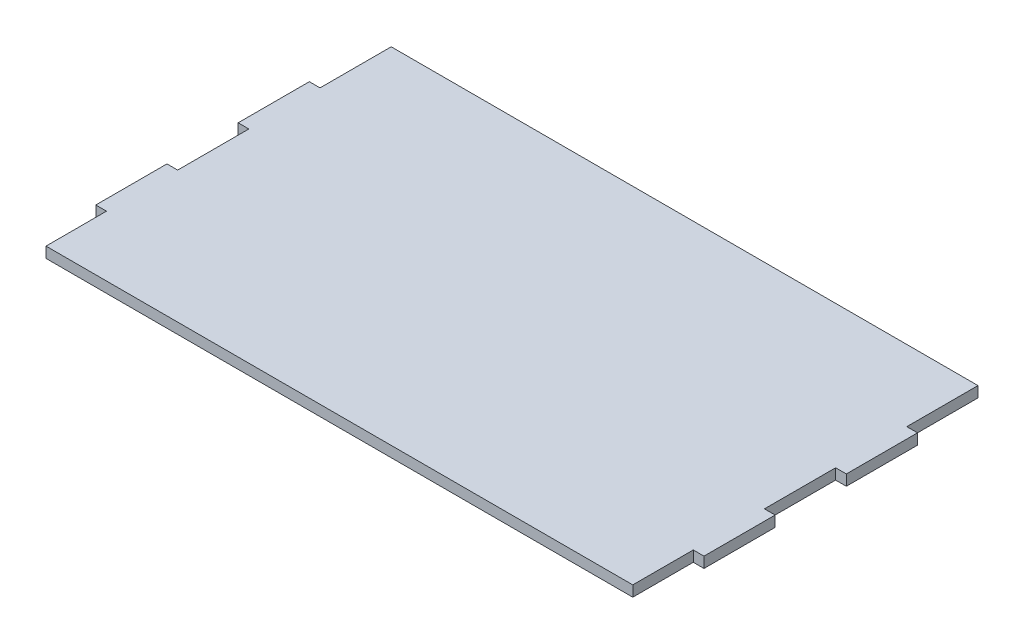
ISO-10303-21;
HEADER;
FILE_DESCRIPTION(('STEP AP214'),'2;1');
FILE_NAME('part.step','',(''),(''),'','','');
FILE_SCHEMA(('AUTOMOTIVE_DESIGN { 1 0 10303 214 1 1 1 1 }'));
ENDSEC;
DATA;
#1=APPLICATION_CONTEXT('core data for automotive mechanical design processes');
#2=APPLICATION_PROTOCOL_DEFINITION('international standard','automotive_design',2000,#1);
#3=PRODUCT_CONTEXT('',#1,'mechanical');
#4=PRODUCT('Part','Part','',(#3));
#5=PRODUCT_RELATED_PRODUCT_CATEGORY('part','',(#4));
#6=PRODUCT_DEFINITION_FORMATION('','',#4);
#7=PRODUCT_DEFINITION_CONTEXT('part definition',#1,'design');
#8=PRODUCT_DEFINITION('design','',#6,#7);
#9=PRODUCT_DEFINITION_SHAPE('','',#8);
#10=(LENGTH_UNIT() NAMED_UNIT(*) SI_UNIT(.MILLI.,.METRE.));
#11=(NAMED_UNIT(*) PLANE_ANGLE_UNIT() SI_UNIT($,.RADIAN.));
#12=(NAMED_UNIT(*) SI_UNIT($,.STERADIAN.) SOLID_ANGLE_UNIT());
#13=UNCERTAINTY_MEASURE_WITH_UNIT(LENGTH_MEASURE(1.E-05),#10,'distance_accuracy_value','');
#14=(GEOMETRIC_REPRESENTATION_CONTEXT(3) GLOBAL_UNCERTAINTY_ASSIGNED_CONTEXT((#13)) GLOBAL_UNIT_ASSIGNED_CONTEXT((#10,
#11,#12)) REPRESENTATION_CONTEXT('',''));
#15=CARTESIAN_POINT('',(0.,0.,0.));
#16=DIRECTION('',(0.,0.,1.));
#17=DIRECTION('',(1.,0.,0.));
#18=AXIS2_PLACEMENT_3D('',#15,#16,#17);
#19=CARTESIAN_POINT('',(-74.,2.7,42.185));
#20=DIRECTION('',(0.,0.,-1.));
#21=DIRECTION('',(-1.,0.,0.));
#22=AXIS2_PLACEMENT_3D('',#19,#20,#21);
#23=PLANE('',#22);
#24=DIRECTION('',(1.,0.,0.));
#25=VECTOR('',#24,1.);
#26=CARTESIAN_POINT('',(-74.,0.,42.185));
#27=LINE('',#26,#25);
#28=CARTESIAN_POINT('',(-74.,0.,42.185));
#29=VERTEX_POINT('',#28);
#30=CARTESIAN_POINT('',(74.,0.,42.185));
#31=VERTEX_POINT('',#30);
#32=EDGE_CURVE('E201',#29,#31,#27,.T.);
#33=ORIENTED_EDGE('',*,*,#32,.T.);
#34=DIRECTION('',(0.,-1.,0.));
#35=VECTOR('',#34,1.);
#36=CARTESIAN_POINT('',(74.,2.7,42.185));
#37=LINE('',#36,#35);
#38=CARTESIAN_POINT('',(74.,2.7,42.185));
#39=VERTEX_POINT('',#38);
#40=EDGE_CURVE('E11',#39,#31,#37,.T.);
#41=ORIENTED_EDGE('',*,*,#40,.F.);
#42=DIRECTION('',(1.,0.,0.));
#43=VECTOR('',#42,1.);
#44=CARTESIAN_POINT('',(-74.,2.7,42.185));
#45=LINE('',#44,#43);
#46=CARTESIAN_POINT('',(-74.,2.7,42.185));
#47=VERTEX_POINT('',#46);
#48=EDGE_CURVE('E239',#47,#39,#45,.T.);
#49=ORIENTED_EDGE('',*,*,#48,.F.);
#50=DIRECTION('',(0.,-1.,0.));
#51=VECTOR('',#50,1.);
#52=CARTESIAN_POINT('',(-74.,2.7,42.185));
#53=LINE('',#52,#51);
#54=EDGE_CURVE('E197',#47,#29,#53,.T.);
#55=ORIENTED_EDGE('',*,*,#54,.T.);
#56=EDGE_LOOP('',(#33,#41,#49,#55));
#57=FACE_BOUND('',#56,.T.);
#58=ADVANCED_FACE('F33',(#57),#23,.F.);
#59=CARTESIAN_POINT('',(74.,2.7,26.931));
#60=DIRECTION('',(-1.,0.,0.));
#61=DIRECTION('',(0.,0.,1.));
#62=AXIS2_PLACEMENT_3D('',#59,#60,#61);
#63=PLANE('',#62);
#64=DIRECTION('',(0.,0.,-1.));
#65=VECTOR('',#64,1.);
#66=CARTESIAN_POINT('',(74.,0.,26.931));
#67=LINE('',#66,#65);
#68=CARTESIAN_POINT('',(74.,0.,26.931));
#69=VERTEX_POINT('',#68);
#70=EDGE_CURVE('E204',#31,#69,#67,.T.);
#71=ORIENTED_EDGE('',*,*,#70,.T.);
#72=DIRECTION('',(0.,-1.,0.));
#73=VECTOR('',#72,1.);
#74=CARTESIAN_POINT('',(74.,2.7,26.931));
#75=LINE('',#74,#73);
#76=CARTESIAN_POINT('',(74.,2.7,26.931));
#77=VERTEX_POINT('',#76);
#78=EDGE_CURVE('E41',#77,#69,#75,.T.);
#79=ORIENTED_EDGE('',*,*,#78,.F.);
#80=DIRECTION('',(0.,0.,-1.));
#81=VECTOR('',#80,1.);
#82=CARTESIAN_POINT('',(74.,2.7,26.931));
#83=LINE('',#82,#81);
#84=EDGE_CURVE('E128',#39,#77,#83,.T.);
#85=ORIENTED_EDGE('',*,*,#84,.F.);
#86=ORIENTED_EDGE('',*,*,#40,.T.);
#87=EDGE_LOOP('',(#71,#79,#85,#86));
#88=FACE_BOUND('',#87,.T.);
#89=ADVANCED_FACE('F357',(#88),#63,.F.);
#90=CARTESIAN_POINT('',(76.7,2.7,26.931));
#91=DIRECTION('',(0.,0.,-1.));
#92=DIRECTION('',(-1.,0.,0.));
#93=AXIS2_PLACEMENT_3D('',#90,#91,#92);
#94=PLANE('',#93);
#95=DIRECTION('',(1.,0.,0.));
#96=VECTOR('',#95,1.);
#97=CARTESIAN_POINT('',(76.7,0.,26.931));
#98=LINE('',#97,#96);
#99=CARTESIAN_POINT('',(76.7,0.,26.931));
#100=VERTEX_POINT('',#99);
#101=EDGE_CURVE('E206',#69,#100,#98,.T.);
#102=ORIENTED_EDGE('',*,*,#101,.T.);
#103=DIRECTION('',(0.,-1.,0.));
#104=VECTOR('',#103,1.);
#105=CARTESIAN_POINT('',(76.7,2.7,26.931));
#106=LINE('',#105,#104);
#107=CARTESIAN_POINT('',(76.7,2.7,26.931));
#108=VERTEX_POINT('',#107);
#109=EDGE_CURVE('E282',#108,#100,#106,.T.);
#110=ORIENTED_EDGE('',*,*,#109,.F.);
#111=DIRECTION('',(1.,0.,0.));
#112=VECTOR('',#111,1.);
#113=CARTESIAN_POINT('',(76.7,2.7,26.931));
#114=LINE('',#113,#112);
#115=EDGE_CURVE('E290',#77,#108,#114,.T.);
#116=ORIENTED_EDGE('',*,*,#115,.F.);
#117=ORIENTED_EDGE('',*,*,#78,.T.);
#118=EDGE_LOOP('',(#102,#110,#116,#117));
#119=FACE_BOUND('',#118,.T.);
#120=ADVANCED_FACE('F288',(#119),#94,.F.);
#121=CARTESIAN_POINT('',(76.7,2.7,26.931));
#122=DIRECTION('',(-1.,0.,0.));
#123=DIRECTION('',(0.,0.,1.));
#124=AXIS2_PLACEMENT_3D('',#121,#122,#123);
#125=PLANE('',#124);
#126=DIRECTION('',(0.,0.,-1.));
#127=VECTOR('',#126,1.);
#128=CARTESIAN_POINT('',(76.7,0.,26.931));
#129=LINE('',#128,#127);
#130=CARTESIAN_POINT('',(76.7,0.,8.97699999999999));
#131=VERTEX_POINT('',#130);
#132=EDGE_CURVE('E208',#100,#131,#129,.T.);
#133=ORIENTED_EDGE('',*,*,#132,.T.);
#134=DIRECTION('',(0.,-1.,0.));
#135=VECTOR('',#134,1.);
#136=CARTESIAN_POINT('',(76.7,2.7,8.97699999999999));
#137=LINE('',#136,#135);
#138=CARTESIAN_POINT('',(76.7,2.7,8.97699999999999));
#139=VERTEX_POINT('',#138);
#140=EDGE_CURVE('E279',#139,#131,#137,.T.);
#141=ORIENTED_EDGE('',*,*,#140,.F.);
#142=DIRECTION('',(0.,0.,-1.));
#143=VECTOR('',#142,1.);
#144=CARTESIAN_POINT('',(76.7,2.7,26.931));
#145=LINE('',#144,#143);
#146=EDGE_CURVE('E308',#108,#139,#145,.T.);
#147=ORIENTED_EDGE('',*,*,#146,.F.);
#148=ORIENTED_EDGE('',*,*,#109,.T.);
#149=EDGE_LOOP('',(#133,#141,#147,#148));
#150=FACE_BOUND('',#149,.T.);
#151=ADVANCED_FACE('F299',(#150),#125,.F.);
#152=CARTESIAN_POINT('',(76.7,2.7,8.97699999999999));
#153=DIRECTION('',(0.,0.,1.));
#154=DIRECTION('',(1.,0.,0.));
#155=AXIS2_PLACEMENT_3D('',#152,#153,#154);
#156=PLANE('',#155);
#157=DIRECTION('',(-1.,0.,0.));
#158=VECTOR('',#157,1.);
#159=CARTESIAN_POINT('',(76.7,0.,8.97699999999999));
#160=LINE('',#159,#158);
#161=CARTESIAN_POINT('',(74.,0.,8.97699999999998));
#162=VERTEX_POINT('',#161);
#163=EDGE_CURVE('E210',#131,#162,#160,.T.);
#164=ORIENTED_EDGE('',*,*,#163,.T.);
#165=DIRECTION('',(0.,-1.,0.));
#166=VECTOR('',#165,1.);
#167=CARTESIAN_POINT('',(74.,2.7,8.97699999999998));
#168=LINE('',#167,#166);
#169=CARTESIAN_POINT('',(74.,2.7,8.97699999999998));
#170=VERTEX_POINT('',#169);
#171=EDGE_CURVE('E276',#170,#162,#168,.T.);
#172=ORIENTED_EDGE('',*,*,#171,.F.);
#173=DIRECTION('',(-1.,0.,0.));
#174=VECTOR('',#173,1.);
#175=CARTESIAN_POINT('',(76.7,2.7,8.97699999999999));
#176=LINE('',#175,#174);
#177=EDGE_CURVE('E305',#139,#170,#176,.T.);
#178=ORIENTED_EDGE('',*,*,#177,.F.);
#179=ORIENTED_EDGE('',*,*,#140,.T.);
#180=EDGE_LOOP('',(#164,#172,#178,#179));
#181=FACE_BOUND('',#180,.T.);
#182=ADVANCED_FACE('F303',(#181),#156,.F.);
#183=CARTESIAN_POINT('',(74.,2.7,-8.97700000000001));
#184=DIRECTION('',(-1.,0.,0.));
#185=DIRECTION('',(0.,0.,1.));
#186=AXIS2_PLACEMENT_3D('',#183,#184,#185);
#187=PLANE('',#186);
#188=DIRECTION('',(0.,0.,-1.));
#189=VECTOR('',#188,1.);
#190=CARTESIAN_POINT('',(74.,0.,-8.97700000000001));
#191=LINE('',#190,#189);
#192=CARTESIAN_POINT('',(74.,0.,-8.97700000000001));
#193=VERTEX_POINT('',#192);
#194=EDGE_CURVE('E212',#162,#193,#191,.T.);
#195=ORIENTED_EDGE('',*,*,#194,.T.);
#196=DIRECTION('',(0.,-1.,0.));
#197=VECTOR('',#196,1.);
#198=CARTESIAN_POINT('',(74.,2.7,-8.97700000000001));
#199=LINE('',#198,#197);
#200=CARTESIAN_POINT('',(74.,2.7,-8.97700000000001));
#201=VERTEX_POINT('',#200);
#202=EDGE_CURVE('E273',#201,#193,#199,.T.);
#203=ORIENTED_EDGE('',*,*,#202,.F.);
#204=DIRECTION('',(0.,0.,-1.));
#205=VECTOR('',#204,1.);
#206=CARTESIAN_POINT('',(74.,2.7,-8.97700000000001));
#207=LINE('',#206,#205);
#208=EDGE_CURVE('E307',#170,#201,#207,.T.);
#209=ORIENTED_EDGE('',*,*,#208,.F.);
#210=ORIENTED_EDGE('',*,*,#171,.T.);
#211=EDGE_LOOP('',(#195,#203,#209,#210));
#212=FACE_BOUND('',#211,.T.);
#213=ADVANCED_FACE('F370',(#212),#187,.F.);
#214=CARTESIAN_POINT('',(76.7,2.7,-8.97700000000001));
#215=DIRECTION('',(0.,0.,-1.));
#216=DIRECTION('',(-1.,0.,0.));
#217=AXIS2_PLACEMENT_3D('',#214,#215,#216);
#218=PLANE('',#217);
#219=DIRECTION('',(1.,0.,0.));
#220=VECTOR('',#219,1.);
#221=CARTESIAN_POINT('',(76.7,0.,-8.97700000000001));
#222=LINE('',#221,#220);
#223=CARTESIAN_POINT('',(76.7,0.,-8.97700000000001));
#224=VERTEX_POINT('',#223);
#225=EDGE_CURVE('E214',#193,#224,#222,.T.);
#226=ORIENTED_EDGE('',*,*,#225,.T.);
#227=DIRECTION('',(0.,-1.,0.));
#228=VECTOR('',#227,1.);
#229=CARTESIAN_POINT('',(76.7,2.7,-8.97700000000001));
#230=LINE('',#229,#228);
#231=CARTESIAN_POINT('',(76.7,2.7,-8.97700000000001));
#232=VERTEX_POINT('',#231);
#233=EDGE_CURVE('E270',#232,#224,#230,.T.);
#234=ORIENTED_EDGE('',*,*,#233,.F.);
#235=DIRECTION('',(1.,0.,0.));
#236=VECTOR('',#235,1.);
#237=CARTESIAN_POINT('',(76.7,2.7,-8.97700000000001));
#238=LINE('',#237,#236);
#239=EDGE_CURVE('E310',#201,#232,#238,.T.);
#240=ORIENTED_EDGE('',*,*,#239,.F.);
#241=ORIENTED_EDGE('',*,*,#202,.T.);
#242=EDGE_LOOP('',(#226,#234,#240,#241));
#243=FACE_BOUND('',#242,.T.);
#244=ADVANCED_FACE('F373',(#243),#218,.F.);
#245=CARTESIAN_POINT('',(76.7,2.7,-8.97700000000001));
#246=DIRECTION('',(-1.,0.,0.));
#247=DIRECTION('',(0.,0.,1.));
#248=AXIS2_PLACEMENT_3D('',#245,#246,#247);
#249=PLANE('',#248);
#250=DIRECTION('',(0.,0.,-1.));
#251=VECTOR('',#250,1.);
#252=CARTESIAN_POINT('',(76.7,0.,-8.97700000000001));
#253=LINE('',#252,#251);
#254=CARTESIAN_POINT('',(76.7,0.,-26.931));
#255=VERTEX_POINT('',#254);
#256=EDGE_CURVE('E216',#224,#255,#253,.T.);
#257=ORIENTED_EDGE('',*,*,#256,.T.);
#258=DIRECTION('',(0.,-1.,0.));
#259=VECTOR('',#258,1.);
#260=CARTESIAN_POINT('',(76.7,2.7,-26.931));
#261=LINE('',#260,#259);
#262=CARTESIAN_POINT('',(76.7,2.7,-26.931));
#263=VERTEX_POINT('',#262);
#264=EDGE_CURVE('E267',#263,#255,#261,.T.);
#265=ORIENTED_EDGE('',*,*,#264,.F.);
#266=DIRECTION('',(0.,0.,-1.));
#267=VECTOR('',#266,1.);
#268=CARTESIAN_POINT('',(76.7,2.7,-8.97700000000001));
#269=LINE('',#268,#267);
#270=EDGE_CURVE('E316',#232,#263,#269,.T.);
#271=ORIENTED_EDGE('',*,*,#270,.F.);
#272=ORIENTED_EDGE('',*,*,#233,.T.);
#273=EDGE_LOOP('',(#257,#265,#271,#272));
#274=FACE_BOUND('',#273,.T.);
#275=ADVANCED_FACE('F377',(#274),#249,.F.);
#276=CARTESIAN_POINT('',(76.7,2.7,-26.931));
#277=DIRECTION('',(0.,0.,1.));
#278=DIRECTION('',(1.,0.,0.));
#279=AXIS2_PLACEMENT_3D('',#276,#277,#278);
#280=PLANE('',#279);
#281=DIRECTION('',(-1.,0.,0.));
#282=VECTOR('',#281,1.);
#283=CARTESIAN_POINT('',(76.7,0.,-26.931));
#284=LINE('',#283,#282);
#285=CARTESIAN_POINT('',(74.,0.,-26.931));
#286=VERTEX_POINT('',#285);
#287=EDGE_CURVE('E218',#255,#286,#284,.T.);
#288=ORIENTED_EDGE('',*,*,#287,.T.);
#289=DIRECTION('',(0.,-1.,0.));
#290=VECTOR('',#289,1.);
#291=CARTESIAN_POINT('',(74.,2.7,-26.931));
#292=LINE('',#291,#290);
#293=CARTESIAN_POINT('',(74.,2.7,-26.931));
#294=VERTEX_POINT('',#293);
#295=EDGE_CURVE('E264',#294,#286,#292,.T.);
#296=ORIENTED_EDGE('',*,*,#295,.F.);
#297=DIRECTION('',(-1.,0.,0.));
#298=VECTOR('',#297,1.);
#299=CARTESIAN_POINT('',(76.7,2.7,-26.931));
#300=LINE('',#299,#298);
#301=EDGE_CURVE('E318',#263,#294,#300,.T.);
#302=ORIENTED_EDGE('',*,*,#301,.F.);
#303=ORIENTED_EDGE('',*,*,#264,.T.);
#304=EDGE_LOOP('',(#288,#296,#302,#303));
#305=FACE_BOUND('',#304,.T.);
#306=ADVANCED_FACE('F381',(#305),#280,.F.);
#307=CARTESIAN_POINT('',(74.,2.7,-44.885));
#308=DIRECTION('',(-1.,0.,0.));
#309=DIRECTION('',(0.,0.,1.));
#310=AXIS2_PLACEMENT_3D('',#307,#308,#309);
#311=PLANE('',#310);
#312=DIRECTION('',(0.,0.,-1.));
#313=VECTOR('',#312,1.);
#314=CARTESIAN_POINT('',(74.,0.,-44.885));
#315=LINE('',#314,#313);
#316=CARTESIAN_POINT('',(74.,0.,-44.885));
#317=VERTEX_POINT('',#316);
#318=EDGE_CURVE('E220',#286,#317,#315,.T.);
#319=ORIENTED_EDGE('',*,*,#318,.T.);
#320=DIRECTION('',(0.,-1.,0.));
#321=VECTOR('',#320,1.);
#322=CARTESIAN_POINT('',(74.,2.7,-44.885));
#323=LINE('',#322,#321);
#324=CARTESIAN_POINT('',(74.,2.7,-44.885));
#325=VERTEX_POINT('',#324);
#326=EDGE_CURVE('E261',#325,#317,#323,.T.);
#327=ORIENTED_EDGE('',*,*,#326,.F.);
#328=DIRECTION('',(0.,0.,-1.));
#329=VECTOR('',#328,1.);
#330=CARTESIAN_POINT('',(74.,2.7,-44.885));
#331=LINE('',#330,#329);
#332=EDGE_CURVE('E320',#294,#325,#331,.T.);
#333=ORIENTED_EDGE('',*,*,#332,.F.);
#334=ORIENTED_EDGE('',*,*,#295,.T.);
#335=EDGE_LOOP('',(#319,#327,#333,#334));
#336=FACE_BOUND('',#335,.T.);
#337=ADVANCED_FACE('F385',(#336),#311,.F.);
#338=CARTESIAN_POINT('',(74.,2.7,-44.885));
#339=DIRECTION('',(0.,0.,1.));
#340=DIRECTION('',(1.,0.,0.));
#341=AXIS2_PLACEMENT_3D('',#338,#339,#340);
#342=PLANE('',#341);
#343=DIRECTION('',(-1.,0.,0.));
#344=VECTOR('',#343,1.);
#345=CARTESIAN_POINT('',(74.,0.,-44.885));
#346=LINE('',#345,#344);
#347=CARTESIAN_POINT('',(-74.,0.,-44.885));
#348=VERTEX_POINT('',#347);
#349=EDGE_CURVE('E222',#317,#348,#346,.T.);
#350=ORIENTED_EDGE('',*,*,#349,.T.);
#351=DIRECTION('',(0.,-1.,0.));
#352=VECTOR('',#351,1.);
#353=CARTESIAN_POINT('',(-74.,2.7,-44.885));
#354=LINE('',#353,#352);
#355=CARTESIAN_POINT('',(-74.,2.7,-44.885));
#356=VERTEX_POINT('',#355);
#357=EDGE_CURVE('E258',#356,#348,#354,.T.);
#358=ORIENTED_EDGE('',*,*,#357,.F.);
#359=DIRECTION('',(-1.,0.,0.));
#360=VECTOR('',#359,1.);
#361=CARTESIAN_POINT('',(74.,2.7,-44.885));
#362=LINE('',#361,#360);
#363=EDGE_CURVE('E322',#325,#356,#362,.T.);
#364=ORIENTED_EDGE('',*,*,#363,.F.);
#365=ORIENTED_EDGE('',*,*,#326,.T.);
#366=EDGE_LOOP('',(#350,#358,#364,#365));
#367=FACE_BOUND('',#366,.T.);
#368=ADVANCED_FACE('F389',(#367),#342,.F.);
#369=CARTESIAN_POINT('',(-74.,2.7,-26.931));
#370=DIRECTION('',(1.,0.,0.));
#371=DIRECTION('',(0.,0.,-1.));
#372=AXIS2_PLACEMENT_3D('',#369,#370,#371);
#373=PLANE('',#372);
#374=DIRECTION('',(0.,0.,1.));
#375=VECTOR('',#374,1.);
#376=CARTESIAN_POINT('',(-74.,0.,-26.931));
#377=LINE('',#376,#375);
#378=CARTESIAN_POINT('',(-74.,0.,-26.931));
#379=VERTEX_POINT('',#378);
#380=EDGE_CURVE('E224',#348,#379,#377,.T.);
#381=ORIENTED_EDGE('',*,*,#380,.T.);
#382=DIRECTION('',(0.,-1.,0.));
#383=VECTOR('',#382,1.);
#384=CARTESIAN_POINT('',(-74.,2.7,-26.931));
#385=LINE('',#384,#383);
#386=CARTESIAN_POINT('',(-74.,2.7,-26.931));
#387=VERTEX_POINT('',#386);
#388=EDGE_CURVE('E255',#387,#379,#385,.T.);
#389=ORIENTED_EDGE('',*,*,#388,.F.);
#390=DIRECTION('',(0.,0.,1.));
#391=VECTOR('',#390,1.);
#392=CARTESIAN_POINT('',(-74.,2.7,-26.931));
#393=LINE('',#392,#391);
#394=EDGE_CURVE('E324',#356,#387,#393,.T.);
#395=ORIENTED_EDGE('',*,*,#394,.F.);
#396=ORIENTED_EDGE('',*,*,#357,.T.);
#397=EDGE_LOOP('',(#381,#389,#395,#396));
#398=FACE_BOUND('',#397,.T.);
#399=ADVANCED_FACE('F393',(#398),#373,.F.);
#400=CARTESIAN_POINT('',(-76.7,2.7,-26.931));
#401=DIRECTION('',(0.,0.,1.));
#402=DIRECTION('',(1.,0.,0.));
#403=AXIS2_PLACEMENT_3D('',#400,#401,#402);
#404=PLANE('',#403);
#405=DIRECTION('',(-1.,0.,0.));
#406=VECTOR('',#405,1.);
#407=CARTESIAN_POINT('',(-76.7,0.,-26.931));
#408=LINE('',#407,#406);
#409=CARTESIAN_POINT('',(-76.7,0.,-26.931));
#410=VERTEX_POINT('',#409);
#411=EDGE_CURVE('E226',#379,#410,#408,.T.);
#412=ORIENTED_EDGE('',*,*,#411,.T.);
#413=DIRECTION('',(0.,-1.,0.));
#414=VECTOR('',#413,1.);
#415=CARTESIAN_POINT('',(-76.7,2.7,-26.931));
#416=LINE('',#415,#414);
#417=CARTESIAN_POINT('',(-76.7,2.7,-26.931));
#418=VERTEX_POINT('',#417);
#419=EDGE_CURVE('E252',#418,#410,#416,.T.);
#420=ORIENTED_EDGE('',*,*,#419,.F.);
#421=DIRECTION('',(-1.,0.,0.));
#422=VECTOR('',#421,1.);
#423=CARTESIAN_POINT('',(-76.7,2.7,-26.931));
#424=LINE('',#423,#422);
#425=EDGE_CURVE('E326',#387,#418,#424,.T.);
#426=ORIENTED_EDGE('',*,*,#425,.F.);
#427=ORIENTED_EDGE('',*,*,#388,.T.);
#428=EDGE_LOOP('',(#412,#420,#426,#427));
#429=FACE_BOUND('',#428,.T.);
#430=ADVANCED_FACE('F397',(#429),#404,.F.);
#431=CARTESIAN_POINT('',(-76.7,2.7,-8.97699999999998));
#432=DIRECTION('',(1.,0.,0.));
#433=DIRECTION('',(0.,0.,-1.));
#434=AXIS2_PLACEMENT_3D('',#431,#432,#433);
#435=PLANE('',#434);
#436=DIRECTION('',(0.,0.,1.));
#437=VECTOR('',#436,1.);
#438=CARTESIAN_POINT('',(-76.7,0.,-8.97699999999998));
#439=LINE('',#438,#437);
#440=CARTESIAN_POINT('',(-76.7,0.,-8.97699999999998));
#441=VERTEX_POINT('',#440);
#442=EDGE_CURVE('E228',#410,#441,#439,.T.);
#443=ORIENTED_EDGE('',*,*,#442,.T.);
#444=DIRECTION('',(0.,-1.,0.));
#445=VECTOR('',#444,1.);
#446=CARTESIAN_POINT('',(-76.7,2.7,-8.97699999999998));
#447=LINE('',#446,#445);
#448=CARTESIAN_POINT('',(-76.7,2.7,-8.97699999999998));
#449=VERTEX_POINT('',#448);
#450=EDGE_CURVE('E249',#449,#441,#447,.T.);
#451=ORIENTED_EDGE('',*,*,#450,.F.);
#452=DIRECTION('',(0.,0.,1.));
#453=VECTOR('',#452,1.);
#454=CARTESIAN_POINT('',(-76.7,2.7,-8.97699999999998));
#455=LINE('',#454,#453);
#456=EDGE_CURVE('E328',#418,#449,#455,.T.);
#457=ORIENTED_EDGE('',*,*,#456,.F.);
#458=ORIENTED_EDGE('',*,*,#419,.T.);
#459=EDGE_LOOP('',(#443,#451,#457,#458));
#460=FACE_BOUND('',#459,.T.);
#461=ADVANCED_FACE('F401',(#460),#435,.F.);
#462=CARTESIAN_POINT('',(-76.7,2.7,-8.97699999999998));
#463=DIRECTION('',(0.,0.,-1.));
#464=DIRECTION('',(-1.,0.,0.));
#465=AXIS2_PLACEMENT_3D('',#462,#463,#464);
#466=PLANE('',#465);
#467=DIRECTION('',(1.,0.,0.));
#468=VECTOR('',#467,1.);
#469=CARTESIAN_POINT('',(-76.7,0.,-8.97699999999998));
#470=LINE('',#469,#468);
#471=CARTESIAN_POINT('',(-74.,0.,-8.97699999999998));
#472=VERTEX_POINT('',#471);
#473=EDGE_CURVE('E230',#441,#472,#470,.T.);
#474=ORIENTED_EDGE('',*,*,#473,.T.);
#475=DIRECTION('',(0.,-1.,0.));
#476=VECTOR('',#475,1.);
#477=CARTESIAN_POINT('',(-74.,2.7,-8.97699999999998));
#478=LINE('',#477,#476);
#479=CARTESIAN_POINT('',(-74.,2.7,-8.97699999999998));
#480=VERTEX_POINT('',#479);
#481=EDGE_CURVE('E246',#480,#472,#478,.T.);
#482=ORIENTED_EDGE('',*,*,#481,.F.);
#483=DIRECTION('',(1.,0.,0.));
#484=VECTOR('',#483,1.);
#485=CARTESIAN_POINT('',(-76.7,2.7,-8.97699999999998));
#486=LINE('',#485,#484);
#487=EDGE_CURVE('E330',#449,#480,#486,.T.);
#488=ORIENTED_EDGE('',*,*,#487,.F.);
#489=ORIENTED_EDGE('',*,*,#450,.T.);
#490=EDGE_LOOP('',(#474,#482,#488,#489));
#491=FACE_BOUND('',#490,.T.);
#492=ADVANCED_FACE('F405',(#491),#466,.F.);
#493=CARTESIAN_POINT('',(-74.,2.7,-8.97699999999998));
#494=DIRECTION('',(1.,0.,0.));
#495=DIRECTION('',(0.,0.,-1.));
#496=AXIS2_PLACEMENT_3D('',#493,#494,#495);
#497=PLANE('',#496);
#498=DIRECTION('',(0.,0.,1.));
#499=VECTOR('',#498,1.);
#500=CARTESIAN_POINT('',(-74.,0.,-8.97699999999998));
#501=LINE('',#500,#499);
#502=CARTESIAN_POINT('',(-74.,0.,8.97699999999999));
#503=VERTEX_POINT('',#502);
#504=EDGE_CURVE('E232',#472,#503,#501,.T.);
#505=ORIENTED_EDGE('',*,*,#504,.T.);
#506=DIRECTION('',(0.,-1.,0.));
#507=VECTOR('',#506,1.);
#508=CARTESIAN_POINT('',(-74.,2.7,8.97699999999999));
#509=LINE('',#508,#507);
#510=CARTESIAN_POINT('',(-74.,2.7,8.97699999999999));
#511=VERTEX_POINT('',#510);
#512=EDGE_CURVE('E243',#511,#503,#509,.T.);
#513=ORIENTED_EDGE('',*,*,#512,.F.);
#514=DIRECTION('',(0.,0.,1.));
#515=VECTOR('',#514,1.);
#516=CARTESIAN_POINT('',(-74.,2.7,-8.97699999999998));
#517=LINE('',#516,#515);
#518=EDGE_CURVE('E332',#480,#511,#517,.T.);
#519=ORIENTED_EDGE('',*,*,#518,.F.);
#520=ORIENTED_EDGE('',*,*,#481,.T.);
#521=EDGE_LOOP('',(#505,#513,#519,#520));
#522=FACE_BOUND('',#521,.T.);
#523=ADVANCED_FACE('F338',(#522),#497,.F.);
#524=CARTESIAN_POINT('',(-76.7,2.7,8.97700000000002));
#525=DIRECTION('',(0.,0.,1.));
#526=DIRECTION('',(1.,0.,0.));
#527=AXIS2_PLACEMENT_3D('',#524,#525,#526);
#528=PLANE('',#527);
#529=DIRECTION('',(-1.,0.,0.));
#530=VECTOR('',#529,1.);
#531=CARTESIAN_POINT('',(-76.7,0.,8.97700000000002));
#532=LINE('',#531,#530);
#533=CARTESIAN_POINT('',(-76.7,0.,8.97700000000002));
#534=VERTEX_POINT('',#533);
#535=EDGE_CURVE('E234',#503,#534,#532,.T.);
#536=ORIENTED_EDGE('',*,*,#535,.T.);
#537=DIRECTION('',(0.,-1.,0.));
#538=VECTOR('',#537,1.);
#539=CARTESIAN_POINT('',(-76.7,2.7,8.97700000000002));
#540=LINE('',#539,#538);
#541=CARTESIAN_POINT('',(-76.7,2.7,8.97700000000002));
#542=VERTEX_POINT('',#541);
#543=EDGE_CURVE('E192',#542,#534,#540,.T.);
#544=ORIENTED_EDGE('',*,*,#543,.F.);
#545=DIRECTION('',(-1.,0.,0.));
#546=VECTOR('',#545,1.);
#547=CARTESIAN_POINT('',(-76.7,2.7,8.97700000000002));
#548=LINE('',#547,#546);
#549=EDGE_CURVE('E183',#511,#542,#548,.T.);
#550=ORIENTED_EDGE('',*,*,#549,.F.);
#551=ORIENTED_EDGE('',*,*,#512,.T.);
#552=EDGE_LOOP('',(#536,#544,#550,#551));
#553=FACE_BOUND('',#552,.T.);
#554=ADVANCED_FACE('F342',(#553),#528,.F.);
#555=CARTESIAN_POINT('',(-76.7,2.7,26.931));
#556=DIRECTION('',(1.,0.,0.));
#557=DIRECTION('',(0.,0.,-1.));
#558=AXIS2_PLACEMENT_3D('',#555,#556,#557);
#559=PLANE('',#558);
#560=DIRECTION('',(0.,0.,1.));
#561=VECTOR('',#560,1.);
#562=CARTESIAN_POINT('',(-76.7,0.,26.931));
#563=LINE('',#562,#561);
#564=CARTESIAN_POINT('',(-76.7,0.,26.931));
#565=VERTEX_POINT('',#564);
#566=EDGE_CURVE('E191',#534,#565,#563,.T.);
#567=ORIENTED_EDGE('',*,*,#566,.T.);
#568=DIRECTION('',(0.,-1.,0.));
#569=VECTOR('',#568,1.);
#570=CARTESIAN_POINT('',(-76.7,2.7,26.931));
#571=LINE('',#570,#569);
#572=CARTESIAN_POINT('',(-76.7,2.7,26.931));
#573=VERTEX_POINT('',#572);
#574=EDGE_CURVE('E188',#573,#565,#571,.T.);
#575=ORIENTED_EDGE('',*,*,#574,.F.);
#576=DIRECTION('',(0.,0.,1.));
#577=VECTOR('',#576,1.);
#578=CARTESIAN_POINT('',(-76.7,2.7,26.931));
#579=LINE('',#578,#577);
#580=EDGE_CURVE('E177',#542,#573,#579,.T.);
#581=ORIENTED_EDGE('',*,*,#580,.F.);
#582=ORIENTED_EDGE('',*,*,#543,.T.);
#583=EDGE_LOOP('',(#567,#575,#581,#582));
#584=FACE_BOUND('',#583,.T.);
#585=ADVANCED_FACE('F189',(#584),#559,.F.);
#586=CARTESIAN_POINT('',(-76.7,2.7,26.931));
#587=DIRECTION('',(0.,0.,-1.));
#588=DIRECTION('',(-1.,0.,0.));
#589=AXIS2_PLACEMENT_3D('',#586,#587,#588);
#590=PLANE('',#589);
#591=DIRECTION('',(1.,0.,0.));
#592=VECTOR('',#591,1.);
#593=CARTESIAN_POINT('',(-76.7,0.,26.931));
#594=LINE('',#593,#592);
#595=CARTESIAN_POINT('',(-74.,0.,26.931));
#596=VERTEX_POINT('',#595);
#597=EDGE_CURVE('E114',#565,#596,#594,.T.);
#598=ORIENTED_EDGE('',*,*,#597,.T.);
#599=DIRECTION('',(0.,-1.,0.));
#600=VECTOR('',#599,1.);
#601=CARTESIAN_POINT('',(-74.,2.7,26.931));
#602=LINE('',#601,#600);
#603=CARTESIAN_POINT('',(-74.,2.7,26.931));
#604=VERTEX_POINT('',#603);
#605=EDGE_CURVE('E193',#604,#596,#602,.T.);
#606=ORIENTED_EDGE('',*,*,#605,.F.);
#607=DIRECTION('',(1.,0.,0.));
#608=VECTOR('',#607,1.);
#609=CARTESIAN_POINT('',(-76.7,2.7,26.931));
#610=LINE('',#609,#608);
#611=EDGE_CURVE('E181',#573,#604,#610,.T.);
#612=ORIENTED_EDGE('',*,*,#611,.F.);
#613=ORIENTED_EDGE('',*,*,#574,.T.);
#614=EDGE_LOOP('',(#598,#606,#612,#613));
#615=FACE_BOUND('',#614,.T.);
#616=ADVANCED_FACE('F195',(#615),#590,.F.);
#617=CARTESIAN_POINT('',(-74.,2.7,26.931));
#618=DIRECTION('',(1.,0.,0.));
#619=DIRECTION('',(0.,0.,-1.));
#620=AXIS2_PLACEMENT_3D('',#617,#618,#619);
#621=PLANE('',#620);
#622=DIRECTION('',(0.,0.,1.));
#623=VECTOR('',#622,1.);
#624=CARTESIAN_POINT('',(-74.,0.,26.931));
#625=LINE('',#624,#623);
#626=EDGE_CURVE('E120',#596,#29,#625,.T.);
#627=ORIENTED_EDGE('',*,*,#626,.T.);
#628=ORIENTED_EDGE('',*,*,#54,.F.);
#629=DIRECTION('',(0.,0.,1.));
#630=VECTOR('',#629,1.);
#631=CARTESIAN_POINT('',(-74.,2.7,26.931));
#632=LINE('',#631,#630);
#633=EDGE_CURVE('E49',#604,#47,#632,.T.);
#634=ORIENTED_EDGE('',*,*,#633,.F.);
#635=ORIENTED_EDGE('',*,*,#605,.T.);
#636=EDGE_LOOP('',(#627,#628,#634,#635));
#637=FACE_BOUND('',#636,.T.);
#638=ADVANCED_FACE('F346',(#637),#621,.F.);
#639=CARTESIAN_POINT('',(0.,2.7,0.));
#640=DIRECTION('',(0.,-1.,0.));
#641=DIRECTION('',(0.,0.,-1.));
#642=AXIS2_PLACEMENT_3D('',#639,#640,#641);
#643=PLANE('',#642);
#644=ORIENTED_EDGE('',*,*,#48,.T.);
#645=ORIENTED_EDGE('',*,*,#84,.T.);
#646=ORIENTED_EDGE('',*,*,#115,.T.);
#647=ORIENTED_EDGE('',*,*,#146,.T.);
#648=ORIENTED_EDGE('',*,*,#177,.T.);
#649=ORIENTED_EDGE('',*,*,#208,.T.);
#650=ORIENTED_EDGE('',*,*,#239,.T.);
#651=ORIENTED_EDGE('',*,*,#270,.T.);
#652=ORIENTED_EDGE('',*,*,#301,.T.);
#653=ORIENTED_EDGE('',*,*,#332,.T.);
#654=ORIENTED_EDGE('',*,*,#363,.T.);
#655=ORIENTED_EDGE('',*,*,#394,.T.);
#656=ORIENTED_EDGE('',*,*,#425,.T.);
#657=ORIENTED_EDGE('',*,*,#456,.T.);
#658=ORIENTED_EDGE('',*,*,#487,.T.);
#659=ORIENTED_EDGE('',*,*,#518,.T.);
#660=ORIENTED_EDGE('',*,*,#549,.T.);
#661=ORIENTED_EDGE('',*,*,#580,.T.);
#662=ORIENTED_EDGE('',*,*,#611,.T.);
#663=ORIENTED_EDGE('',*,*,#633,.T.);
#664=EDGE_LOOP('',(#644,#645,#646,#647,#648,#649,#650,#651,#652,#653,#654,#655,#656,#657,#658,
#659,#660,#661,#662,#663));
#665=FACE_BOUND('',#664,.T.);
#666=ADVANCED_FACE('F179',(#665),#643,.F.);
#667=CARTESIAN_POINT('',(0.,0.,0.));
#668=DIRECTION('',(0.,-1.,0.));
#669=DIRECTION('',(0.,0.,-1.));
#670=AXIS2_PLACEMENT_3D('',#667,#668,#669);
#671=PLANE('',#670);
#672=ORIENTED_EDGE('',*,*,#32,.F.);
#673=ORIENTED_EDGE('',*,*,#626,.F.);
#674=ORIENTED_EDGE('',*,*,#597,.F.);
#675=ORIENTED_EDGE('',*,*,#566,.F.);
#676=ORIENTED_EDGE('',*,*,#535,.F.);
#677=ORIENTED_EDGE('',*,*,#504,.F.);
#678=ORIENTED_EDGE('',*,*,#473,.F.);
#679=ORIENTED_EDGE('',*,*,#442,.F.);
#680=ORIENTED_EDGE('',*,*,#411,.F.);
#681=ORIENTED_EDGE('',*,*,#380,.F.);
#682=ORIENTED_EDGE('',*,*,#349,.F.);
#683=ORIENTED_EDGE('',*,*,#318,.F.);
#684=ORIENTED_EDGE('',*,*,#287,.F.);
#685=ORIENTED_EDGE('',*,*,#256,.F.);
#686=ORIENTED_EDGE('',*,*,#225,.F.);
#687=ORIENTED_EDGE('',*,*,#194,.F.);
#688=ORIENTED_EDGE('',*,*,#163,.F.);
#689=ORIENTED_EDGE('',*,*,#132,.F.);
#690=ORIENTED_EDGE('',*,*,#101,.F.);
#691=ORIENTED_EDGE('',*,*,#70,.F.);
#692=EDGE_LOOP('',(#672,#673,#674,#675,#676,#677,#678,#679,#680,#681,#682,#683,#684,#685,#686,
#687,#688,#689,#690,#691));
#693=FACE_BOUND('',#692,.T.);
#694=ADVANCED_FACE('F294',(#693),#671,.T.);
#695=CLOSED_SHELL('',(#58,#89,#120,#151,#182,#213,#244,#275,#306,#337,#368,#399,#430,#461,#492,
#523,#554,#585,#616,#638,#666,#694));
#696=MANIFOLD_SOLID_BREP('B2',#695);
#697=ADVANCED_BREP_SHAPE_REPRESENTATION('',(#18,#696),#14);
#698=SHAPE_DEFINITION_REPRESENTATION(#9,#697);
ENDSEC;
END-ISO-10303-21;
